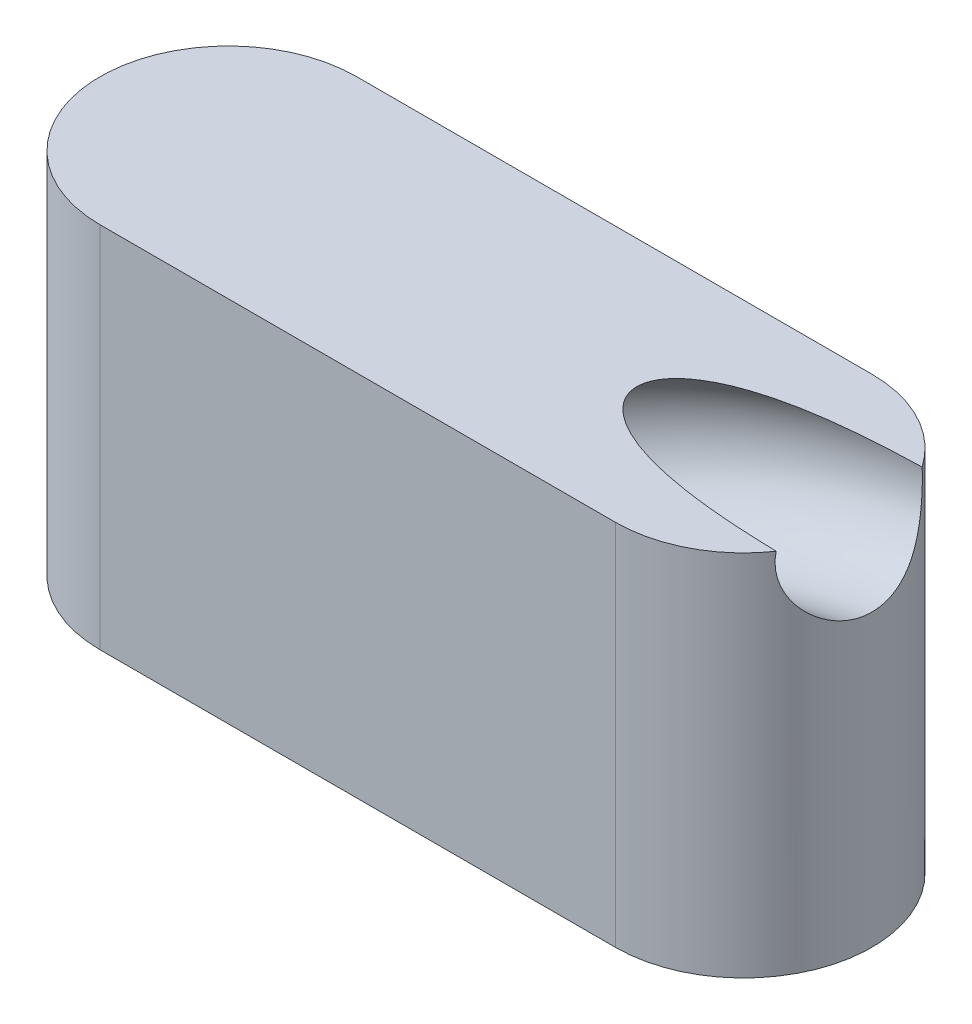
ISO-10303-21;
HEADER;
FILE_DESCRIPTION(('STEP AP214'),'2;1');
FILE_NAME('part.step','',(''),(''),'','','');
FILE_SCHEMA(('AUTOMOTIVE_DESIGN { 1 0 10303 214 1 1 1 1 }'));
ENDSEC;
DATA;
#1=APPLICATION_CONTEXT('core data for automotive mechanical design processes');
#2=APPLICATION_PROTOCOL_DEFINITION('international standard','automotive_design',2000,#1);
#3=PRODUCT_CONTEXT('',#1,'mechanical');
#4=PRODUCT('Part','Part','',(#3));
#5=PRODUCT_RELATED_PRODUCT_CATEGORY('part','',(#4));
#6=PRODUCT_DEFINITION_FORMATION('','',#4);
#7=PRODUCT_DEFINITION_CONTEXT('part definition',#1,'design');
#8=PRODUCT_DEFINITION('design','',#6,#7);
#9=PRODUCT_DEFINITION_SHAPE('','',#8);
#10=(LENGTH_UNIT() NAMED_UNIT(*) SI_UNIT(.MILLI.,.METRE.));
#11=(NAMED_UNIT(*) PLANE_ANGLE_UNIT() SI_UNIT($,.RADIAN.));
#12=(NAMED_UNIT(*) SI_UNIT($,.STERADIAN.) SOLID_ANGLE_UNIT());
#13=UNCERTAINTY_MEASURE_WITH_UNIT(LENGTH_MEASURE(1.E-05),#10,'distance_accuracy_value','');
#14=(GEOMETRIC_REPRESENTATION_CONTEXT(3) GLOBAL_UNCERTAINTY_ASSIGNED_CONTEXT((#13)) GLOBAL_UNIT_ASSIGNED_CONTEXT((#10,
#11,#12)) REPRESENTATION_CONTEXT('',''));
#15=CARTESIAN_POINT('',(0.,0.,0.));
#16=DIRECTION('',(0.,0.,1.));
#17=DIRECTION('',(1.,0.,0.));
#18=AXIS2_PLACEMENT_3D('',#15,#16,#17);
#19=CARTESIAN_POINT('',(0.362795252074542,1.,0.));
#20=DIRECTION('',(0.,-1.,0.));
#21=DIRECTION('',(0.,0.,-1.));
#22=AXIS2_PLACEMENT_3D('',#19,#20,#21);
#23=CYLINDRICAL_SURFACE('',#22,0.3484375);
#24=CARTESIAN_POINT('',(0.649361666895862,1.,0.198212969562301));
#25=CARTESIAN_POINT('',(0.648517202907294,0.991117271706397,0.199414829552838));
#26=CARTESIAN_POINT('',(0.648100500718645,0.982103586953111,0.200018826827524));
#27=CARTESIAN_POINT('',(0.648134543909756,0.964109738444706,0.199980624730701));
#28=CARTESIAN_POINT('',(0.648582619282322,0.955129557008913,0.199342261106749));
#29=CARTESIAN_POINT('',(0.650355077640837,0.937417295031375,0.19677357914616));
#30=CARTESIAN_POINT('',(0.651681716418819,0.928685913658528,0.194839934910494));
#31=CARTESIAN_POINT('',(0.655061235490028,0.911752092386084,0.189733332606763));
#32=CARTESIAN_POINT('',(0.65711412082776,0.903549656161005,0.186560365930359));
#33=CARTESIAN_POINT('',(0.664021974054252,0.880029698181463,0.17534938984082));
#34=CARTESIAN_POINT('',(0.669635671328491,0.865731251334484,0.165608522573498));
#35=CARTESIAN_POINT('',(0.681874478603899,0.838572292691496,0.14076102961292));
#36=CARTESIAN_POINT('',(0.688522043138537,0.826273695516651,0.125058537357036));
#37=CARTESIAN_POINT('',(0.697312531447876,0.81099066143996,0.098042965927252));
#38=CARTESIAN_POINT('',(0.700145355431347,0.80629487303342,0.0878743670289919));
#39=CARTESIAN_POINT('',(0.704948702998827,0.798513951304371,0.0667532125240499));
#40=CARTESIAN_POINT('',(0.706920593660662,0.79542626296138,0.0558019321598346));
#41=CARTESIAN_POINT('',(0.709782813845783,0.790984327671032,0.0336283081274207));
#42=CARTESIAN_POINT('',(0.710692378573893,0.789599227425488,0.0224146610812358));
#43=CARTESIAN_POINT('',(0.711416354160109,0.788497625898102,-0.000118422939476118));
#44=CARTESIAN_POINT('',(0.711231133382914,0.788780563368146,-0.0114378230512873));
#45=CARTESIAN_POINT('',(0.709092508884281,0.792040497473301,-0.0440469818199158));
#46=CARTESIAN_POINT('',(0.705687507834727,0.797228593328143,-0.0650662873275951));
#47=CARTESIAN_POINT('',(0.695846556975421,0.813385794278239,-0.104448879632646));
#48=CARTESIAN_POINT('',(0.689347519161211,0.824475822903307,-0.122745966379454));
#49=CARTESIAN_POINT('',(0.678871308505093,0.845296724935748,-0.146933035580533));
#50=CARTESIAN_POINT('',(0.675157310917489,0.853184297409282,-0.15459529086973));
#51=CARTESIAN_POINT('',(0.667956803955203,0.870316363527483,-0.168358820838344));
#52=CARTESIAN_POINT('',(0.664469905725943,0.879558444688783,-0.174462818964527));
#53=CARTESIAN_POINT('',(0.65888710255837,0.89714043643236,-0.183742995098132));
#54=CARTESIAN_POINT('',(0.656653078136644,0.905254344783612,-0.187265742536718));
#55=CARTESIAN_POINT('',(0.65287324314083,0.922067212811305,-0.193067962791472));
#56=CARTESIAN_POINT('',(0.651326891066837,0.930765705927303,-0.195348414159315));
#57=CARTESIAN_POINT('',(0.648985343070233,0.949490449733683,-0.198770825580921));
#58=CARTESIAN_POINT('',(0.648291471491573,0.959557509340505,-0.199759978707434));
#59=CARTESIAN_POINT('',(0.647994018418514,0.979806447728347,-0.200167458286132));
#60=CARTESIAN_POINT('',(0.648397549825227,0.989988647548834,-0.199575537327985));
#61=CARTESIAN_POINT('',(0.649361666895862,1.,-0.1982129695623));
#62=B_SPLINE_CURVE_WITH_KNOTS('',3,(#24,#25,#26,#27,#28,#29,#30,#31,#32,#33,#34,#35,#36,#37,#38,
#39,#40,#41,#42,#43,#44,#45,#46,#47,#48,#49,#50,#51,#52,#53,#54,#55,#56,#57,#58,#59,#60,#61),
.UNSPECIFIED.,.F.,.F.,(4,2,2,2,2,2,2,2,2,2,2,2,2,2,2,2,2,2,4),(0.,0.0269951663870324,
0.0539071183168555,0.0808884384493803,0.107869945997655,0.161633355234993,0.223688936611937,
0.258205788611387,0.292667630104178,0.326495302563187,0.360311593604739,0.424804622556855,
0.490672998104435,0.52534944492066,0.559964864457072,0.58722021021727,0.614454055892135,
0.644683282892519,0.675108909109647),.UNSPECIFIED.);
#63=CARTESIAN_POINT('',(0.649361666908891,1.,0.198212969562642));
#64=VERTEX_POINT('',#63);
#65=CARTESIAN_POINT('',(0.649361666895862,1.,-0.198212969562301));
#66=VERTEX_POINT('',#65);
#67=EDGE_CURVE('E54',#64,#66,#62,.T.);
#68=ORIENTED_EDGE('',*,*,#67,.F.);
#69=CARTESIAN_POINT('',(0.362795252074542,1.,0.));
#70=DIRECTION('',(0.,1.,0.));
#71=DIRECTION('',(0.,0.,1.));
#72=AXIS2_PLACEMENT_3D('',#69,#70,#71);
#73=CIRCLE('',#72,0.3484375);
#74=CARTESIAN_POINT('',(0.362795252074542,1.,0.3484375));
#75=VERTEX_POINT('',#74);
#76=EDGE_CURVE('E164',#75,#64,#73,.T.);
#77=ORIENTED_EDGE('',*,*,#76,.F.);
#78=DIRECTION('',(0.,-1.,0.));
#79=VECTOR('',#78,1.);
#80=CARTESIAN_POINT('',(0.362795252074542,1.,0.3484375));
#81=LINE('',#80,#79);
#82=CARTESIAN_POINT('',(0.362795252074542,0.,0.3484375));
#83=VERTEX_POINT('',#82);
#84=EDGE_CURVE('E102',#75,#83,#81,.T.);
#85=ORIENTED_EDGE('',*,*,#84,.T.);
#86=CARTESIAN_POINT('',(0.362795252074542,0.,0.));
#87=DIRECTION('',(0.,1.,0.));
#88=DIRECTION('',(0.,0.,1.));
#89=AXIS2_PLACEMENT_3D('',#86,#87,#88);
#90=CIRCLE('',#89,0.3484375);
#91=CARTESIAN_POINT('',(0.362795252074542,0.,-0.3484375));
#92=VERTEX_POINT('',#91);
#93=EDGE_CURVE('E111',#83,#92,#90,.T.);
#94=ORIENTED_EDGE('',*,*,#93,.T.);
#95=DIRECTION('',(0.,-1.,0.));
#96=VECTOR('',#95,1.);
#97=CARTESIAN_POINT('',(0.362795252074542,1.,-0.3484375));
#98=LINE('',#97,#96);
#99=CARTESIAN_POINT('',(0.362795252074542,1.,-0.3484375));
#100=VERTEX_POINT('',#99);
#101=EDGE_CURVE('E120',#100,#92,#98,.T.);
#102=ORIENTED_EDGE('',*,*,#101,.F.);
#103=EDGE_CURVE('E167',#66,#100,#73,.T.);
#104=ORIENTED_EDGE('',*,*,#103,.F.);
#105=EDGE_LOOP('',(#68,#77,#85,#94,#102,#104));
#106=FACE_BOUND('',#105,.T.);
#107=ADVANCED_FACE('F35',(#106),#23,.T.);
#108=CARTESIAN_POINT('',(0.,1.,0.));
#109=DIRECTION('',(0.,1.,0.));
#110=DIRECTION('',(0.,0.,1.));
#111=AXIS2_PLACEMENT_3D('',#108,#109,#110);
#112=PLANE('',#111);
#113=ORIENTED_EDGE('',*,*,#76,.T.);
#114=CARTESIAN_POINT('',(0.723814002074542,1.,0.199559610287932));
#115=CARTESIAN_POINT('',(0.703405166295891,1.00000000000004,0.199332418436753));
#116=CARTESIAN_POINT('',(0.682996072813127,1.00000000000002,0.199007798475352));
#117=CARTESIAN_POINT('',(0.642132369386596,0.999999999999981,0.198067815406427));
#118=CARTESIAN_POINT('',(0.621677777141294,0.999999999999961,0.19745170783836));
#119=CARTESIAN_POINT('',(0.580762386859649,1.00000000000004,0.195832238535436));
#120=CARTESIAN_POINT('',(0.560301603298726,1.00000000000014,0.194828487651405));
#121=CARTESIAN_POINT('',(0.518542405981056,0.999999999999859,0.192261338113752));
#122=CARTESIAN_POINT('',(0.497245310424176,0.999999999999465,0.190675988421826));
#123=CARTESIAN_POINT('',(0.4547293033293,1.00000000000053,0.186793778318933));
#124=CARTESIAN_POINT('',(0.433510343090811,1.000000000002,0.184497484633373));
#125=CARTESIAN_POINT('',(0.391207281935416,0.999999999998004,0.178980139996886));
#126=CARTESIAN_POINT('',(0.370123115214191,0.999999999992554,0.175759582200526));
#127=CARTESIAN_POINT('',(0.317927704168776,0.999999999988212,0.166269134700934));
#128=CARTESIAN_POINT('',(0.286929568180333,0.999999999993805,0.159278002224989));
#129=CARTESIAN_POINT('',(0.241472651058109,1.00000000000307,0.145732331470315));
#130=CARTESIAN_POINT('',(0.226554380371177,1.00000000000629,0.140734653105423));
#131=CARTESIAN_POINT('',(0.197201087307615,0.999999999993701,0.129394161689924));
#132=CARTESIAN_POINT('',(0.182766569015562,0.999999999977871,0.123049993108442));
#133=CARTESIAN_POINT('',(0.157945727841669,0.999999999982307,0.110176031778146));
#134=CARTESIAN_POINT('',(0.147376873597486,0.999999999995281,0.104006141366335));
#135=CARTESIAN_POINT('',(0.127217196176411,1.0000000000047,0.0902670126338788));
#136=CARTESIAN_POINT('',(0.117622997273348,1.00000000000121,0.0827028787819455));
#137=CARTESIAN_POINT('',(0.0999709409087105,0.999999999998659,0.0655791482820708));
#138=CARTESIAN_POINT('',(0.0919406747504289,0.999999999999678,0.0559890354423328));
#139=CARTESIAN_POINT('',(0.0804030457784911,1.00000000000027,0.0362888786313305));
#140=CARTESIAN_POINT('',(0.0763735785141326,1.00000000000005,0.0265150116655929));
#141=CARTESIAN_POINT('',(0.0732161845373014,0.999999999999975,0.0112064831594961));
#142=CARTESIAN_POINT('',(0.0726500459924456,0.999999999999993,0.00596392490293829));
#143=CARTESIAN_POINT('',(0.0725564279538344,1.00000000000001,-0.00452984965842318));
#144=CARTESIAN_POINT('',(0.0730287466444804,1.,-0.0097810640827856));
#145=CARTESIAN_POINT('',(0.0756772729787471,0.999999999999995,-0.0238530994933758));
#146=CARTESIAN_POINT('',(0.0788434564659947,0.999999999999999,-0.0324900716693002));
#147=CARTESIAN_POINT('',(0.0895387594081238,1.,-0.0530189917884646));
#148=CARTESIAN_POINT('',(0.0985072593337248,1.,-0.0641057372623232));
#149=CARTESIAN_POINT('',(0.117400947807949,0.999999999999999,-0.0825328240954383));
#150=CARTESIAN_POINT('',(0.127071837992941,1.,-0.0901665438062459));
#151=CARTESIAN_POINT('',(0.147401326711332,1.,-0.104024184576535));
#152=CARTESIAN_POINT('',(0.158062416424782,1.,-0.110244406313198));
#153=CARTESIAN_POINT('',(0.183843944138124,0.999999999999997,-0.123597912190108));
#154=CARTESIAN_POINT('',(0.199198721126587,0.99999999999999,-0.13026562678008));
#155=CARTESIAN_POINT('',(0.230438527768441,1.00000000000001,-0.14211606641372));
#156=CARTESIAN_POINT('',(0.246323241270974,1.00000000000004,-0.147299659775819));
#157=CARTESIAN_POINT('',(0.29475189911505,0.999999999999925,-0.161274988381435));
#158=CARTESIAN_POINT('',(0.327782051809523,0.999999999999586,-0.168362979645339));
#159=CARTESIAN_POINT('',(0.381368615412435,0.999999999999717,-0.1775181533015));
#160=CARTESIAN_POINT('',(0.401798534202616,0.999999999999924,-0.180466579146242));
#161=CARTESIAN_POINT('',(0.442774291333739,1.00000000000008,-0.185531332958379));
#162=CARTESIAN_POINT('',(0.463320177951224,1.00000000000002,-0.187647283745508));
#163=CARTESIAN_POINT('',(0.504478663703542,0.99999999999998,-0.191234617091081));
#164=CARTESIAN_POINT('',(0.525091298601411,0.999999999999995,-0.192705562049981));
#165=CARTESIAN_POINT('',(0.565509943908318,1.00000000000001,-0.19509518161076));
#166=CARTESIAN_POINT('',(0.585314796627791,1.,-0.196033818524319));
#167=CARTESIAN_POINT('',(0.624920521614708,0.999999999999999,-0.197553946380209));
#168=CARTESIAN_POINT('',(0.644721382934847,0.999999999999999,-0.19813574047801));
#169=CARTESIAN_POINT('',(0.684286217177371,1.,-0.199028401122379));
#170=CARTESIAN_POINT('',(0.704050176414334,1.,-0.19933985552889));
#171=CARTESIAN_POINT('',(0.723814002074542,0.999999999999999,-0.199559610287932));
#172=B_SPLINE_CURVE_WITH_KNOTS('',3,(#114,#115,#116,#117,#118,#119,#120,#121,#122,#123,#124,
#125,#126,#127,#128,#129,#130,#131,#132,#133,#134,#135,#136,#137,#138,#139,#140,#141,#142,#143,
#144,#145,#146,#147,#148,#149,#150,#151,#152,#153,#154,#155,#156,#157,#158,#159,#160,#161,#162,
#163,#164,#165,#166,#167,#168,#169,#170,#171),.UNSPECIFIED.,.F.,.F.,(4,2,2,2,2,2,2,2,2,2,2,2,2,
2,2,2,2,2,2,2,2,2,2,2,2,2,2,2,4),(0.,0.0612320972237044,0.122621432730623,0.184072556921487,
0.248132637806722,0.312141784431897,0.3761168413407,0.471222066906372,0.518379242892503,
0.565584119790097,0.602215142914862,0.638714627894934,0.6758090516198,0.706891466622746,
0.722612886202471,0.738331250724045,0.765490512584862,0.807512090683877,0.844352520428344,
0.881288283932266,0.93139724920439,0.981476836910738,1.08257311794669,1.14449163862772,
1.2064381813163,1.26842668640897,1.32790350061017,1.38732971609985,1.44662638181955),.UNSPECIFIED.);
#173=EDGE_CURVE('E11',#64,#66,#172,.T.);
#174=ORIENTED_EDGE('',*,*,#173,.T.);
#175=ORIENTED_EDGE('',*,*,#103,.T.);
#176=DIRECTION('',(1.,0.,0.));
#177=VECTOR('',#176,1.);
#178=CARTESIAN_POINT('',(0.,1.,-0.3484375));
#179=LINE('',#178,#177);
#180=CARTESIAN_POINT('',(-1.03720474792546,1.,-0.3484375));
#181=VERTEX_POINT('',#180);
#182=EDGE_CURVE('E170',#181,#100,#179,.T.);
#183=ORIENTED_EDGE('',*,*,#182,.F.);
#184=CARTESIAN_POINT('',(-1.03720474792546,1.,0.));
#185=DIRECTION('',(0.,1.,0.));
#186=DIRECTION('',(0.,0.,1.));
#187=AXIS2_PLACEMENT_3D('',#184,#185,#186);
#188=CIRCLE('',#187,0.3484375);
#189=CARTESIAN_POINT('',(-1.03720474792546,1.,0.3484375));
#190=VERTEX_POINT('',#189);
#191=EDGE_CURVE('E118',#181,#190,#188,.T.);
#192=ORIENTED_EDGE('',*,*,#191,.T.);
#193=DIRECTION('',(1.,0.,0.));
#194=VECTOR('',#193,1.);
#195=CARTESIAN_POINT('',(0.,1.,0.3484375));
#196=LINE('',#195,#194);
#197=EDGE_CURVE('E109',#190,#75,#196,.T.);
#198=ORIENTED_EDGE('',*,*,#197,.T.);
#199=EDGE_LOOP('',(#113,#174,#175,#183,#192,#198));
#200=FACE_BOUND('',#199,.T.);
#201=ADVANCED_FACE('F156',(#200),#112,.T.);
#202=CARTESIAN_POINT('',(0.,1.,0.3484375));
#203=DIRECTION('',(0.,0.,-1.));
#204=DIRECTION('',(-1.,0.,0.));
#205=AXIS2_PLACEMENT_3D('',#202,#203,#204);
#206=PLANE('',#205);
#207=DIRECTION('',(1.,0.,0.));
#208=VECTOR('',#207,1.);
#209=CARTESIAN_POINT('',(0.,0.,0.3484375));
#210=LINE('',#209,#208);
#211=CARTESIAN_POINT('',(-1.03720474792546,0.,0.3484375));
#212=VERTEX_POINT('',#211);
#213=EDGE_CURVE('E106',#212,#83,#210,.T.);
#214=ORIENTED_EDGE('',*,*,#213,.T.);
#215=ORIENTED_EDGE('',*,*,#84,.F.);
#216=ORIENTED_EDGE('',*,*,#197,.F.);
#217=DIRECTION('',(0.,-1.,0.));
#218=VECTOR('',#217,1.);
#219=CARTESIAN_POINT('',(-1.03720474792546,1.,0.3484375));
#220=LINE('',#219,#218);
#221=EDGE_CURVE('E115',#190,#212,#220,.T.);
#222=ORIENTED_EDGE('',*,*,#221,.T.);
#223=EDGE_LOOP('',(#214,#215,#216,#222));
#224=FACE_BOUND('',#223,.T.);
#225=ADVANCED_FACE('F37',(#224),#206,.F.);
#226=CARTESIAN_POINT('',(0.,1.,-0.3484375));
#227=DIRECTION('',(0.,0.,-1.));
#228=DIRECTION('',(-1.,0.,0.));
#229=AXIS2_PLACEMENT_3D('',#226,#227,#228);
#230=PLANE('',#229);
#231=DIRECTION('',(1.,0.,0.));
#232=VECTOR('',#231,1.);
#233=CARTESIAN_POINT('',(0.,0.,-0.3484375));
#234=LINE('',#233,#232);
#235=CARTESIAN_POINT('',(-1.03720474792546,0.,-0.3484375));
#236=VERTEX_POINT('',#235);
#237=EDGE_CURVE('E107',#236,#92,#234,.T.);
#238=ORIENTED_EDGE('',*,*,#237,.F.);
#239=DIRECTION('',(0.,-1.,0.));
#240=VECTOR('',#239,1.);
#241=CARTESIAN_POINT('',(-1.03720474792546,1.,-0.3484375));
#242=LINE('',#241,#240);
#243=EDGE_CURVE('E117',#181,#236,#242,.T.);
#244=ORIENTED_EDGE('',*,*,#243,.F.);
#245=ORIENTED_EDGE('',*,*,#182,.T.);
#246=ORIENTED_EDGE('',*,*,#101,.T.);
#247=EDGE_LOOP('',(#238,#244,#245,#246));
#248=FACE_BOUND('',#247,.T.);
#249=ADVANCED_FACE('F151',(#248),#230,.T.);
#250=CARTESIAN_POINT('',(-1.03720474792546,1.,0.));
#251=DIRECTION('',(0.,-1.,0.));
#252=DIRECTION('',(0.,0.,-1.));
#253=AXIS2_PLACEMENT_3D('',#250,#251,#252);
#254=CYLINDRICAL_SURFACE('',#253,0.3484375);
#255=CARTESIAN_POINT('',(-1.03720474792546,0.,0.));
#256=DIRECTION('',(0.,1.,0.));
#257=DIRECTION('',(0.,0.,1.));
#258=AXIS2_PLACEMENT_3D('',#255,#256,#257);
#259=CIRCLE('',#258,0.3484375);
#260=CARTESIAN_POINT('',(-1.32302411635154,0.,-0.199288685174958));
#261=VERTEX_POINT('',#260);
#262=EDGE_CURVE('E97',#236,#261,#259,.T.);
#263=ORIENTED_EDGE('',*,*,#262,.T.);
#264=CARTESIAN_POINT('',(-1.32302411635154,0.,-0.199288685174957));
#265=CARTESIAN_POINT('',(-1.32248098585934,0.00905124269627235,-0.200048122509492));
#266=CARTESIAN_POINT('',(-1.32237717872784,0.0181897564897757,-0.200208764880249));
#267=CARTESIAN_POINT('',(-1.32303631595712,0.0363445553302654,-0.199277389109151));
#268=CARTESIAN_POINT('',(-1.32379690318763,0.0453611052570405,-0.198188777498394));
#269=CARTESIAN_POINT('',(-1.32617345528739,0.0630523466319441,-0.1947036441222));
#270=CARTESIAN_POINT('',(-1.32779182940324,0.0717260008915069,-0.192303437919541));
#271=CARTESIAN_POINT('',(-1.33170920291049,0.0884476832746563,-0.186249939458238));
#272=CARTESIAN_POINT('',(-1.3340081111446,0.0964957950072577,-0.182596815017146));
#273=CARTESIAN_POINT('',(-1.34152786775986,0.119337150006703,-0.16997014763793));
#274=CARTESIAN_POINT('',(-1.34740188184637,0.132997180799245,-0.159293919761165));
#275=CARTESIAN_POINT('',(-1.35975369687347,0.158342286551954,-0.132717506038557));
#276=CARTESIAN_POINT('',(-1.36620019371086,0.169479219580518,-0.116293720288771));
#277=CARTESIAN_POINT('',(-1.37730543970788,0.187674821649596,-0.0785094301333011));
#278=CARTESIAN_POINT('',(-1.38171733444075,0.194206890389753,-0.0568175784218504));
#279=CARTESIAN_POINT('',(-1.38615034386878,0.200767875874122,-0.0121065539396438));
#280=CARTESIAN_POINT('',(-1.38618778031744,0.200820966680103,0.0109073642385806));
#281=CARTESIAN_POINT('',(-1.38196601970391,0.194576982366869,0.0550751065098025));
#282=CARTESIAN_POINT('',(-1.37780086964362,0.188418904133014,0.0762586227437397));
#283=CARTESIAN_POINT('',(-1.36655932205963,0.170128554656573,0.115576962264659));
#284=CARTESIAN_POINT('',(-1.35942616715821,0.157878848540628,0.133642056388982));
#285=CARTESIAN_POINT('',(-1.34858208563983,0.135294677092673,0.156617284469976));
#286=CARTESIAN_POINT('',(-1.34491721861542,0.126991903225214,0.163622739981041));
#287=CARTESIAN_POINT('',(-1.3380324149416,0.109054899240248,0.175955924377772));
#288=CARTESIAN_POINT('',(-1.33481164225252,0.0994232412043139,0.181286830603282));
#289=CARTESIAN_POINT('',(-1.32961329006294,0.0801886250080146,0.189545675835665));
#290=CARTESIAN_POINT('',(-1.32753835149338,0.0706974211993188,0.192672470213391));
#291=CARTESIAN_POINT('',(-1.32441255610087,0.0511614093255887,0.197302763819104));
#292=CARTESIAN_POINT('',(-1.32336124931816,0.0411168465550275,0.198806976319902));
#293=CARTESIAN_POINT('',(-1.32261114022754,0.0258395851271172,0.199879757909744));
#294=CARTESIAN_POINT('',(-1.32250227774133,0.020656911472093,0.200035275277853));
#295=CARTESIAN_POINT('',(-1.32256054445219,0.0103088704339392,0.199951658567757));
#296=CARTESIAN_POINT('',(-1.32272698610144,0.00514349212233509,0.199713507642351));
#297=CARTESIAN_POINT('',(-1.32302411635154,0.,0.199288685174958));
#298=B_SPLINE_CURVE_WITH_KNOTS('',3,(#264,#265,#266,#267,#268,#269,#270,#271,#272,#273,#274,
#275,#276,#277,#278,#279,#280,#281,#282,#283,#284,#285,#286,#287,#288,#289,#290,#291,#292,#293,
#294,#295,#296,#297),.UNSPECIFIED.,.F.,.F.,(4,2,2,2,2,2,2,2,2,2,2,2,2,2,2,2,4),(0.,
0.0272851338937106,0.0544960416952917,0.0817837843336239,0.109067873441483,0.163132721460462,
0.224803053201291,0.292712686504393,0.36036893075905,0.426543996582564,0.494047349932425,
0.528280675478983,0.562448647749929,0.592884912266571,0.623307791808055,0.638846840913065,
0.65434714117588),.UNSPECIFIED.);
#299=CARTESIAN_POINT('',(-1.3230241163674,0.,0.199288685175334));
#300=VERTEX_POINT('',#299);
#301=EDGE_CURVE('E60',#261,#300,#298,.T.);
#302=ORIENTED_EDGE('',*,*,#301,.T.);
#303=EDGE_CURVE('E94',#300,#212,#259,.T.);
#304=ORIENTED_EDGE('',*,*,#303,.T.);
#305=ORIENTED_EDGE('',*,*,#221,.F.);
#306=ORIENTED_EDGE('',*,*,#191,.F.);
#307=ORIENTED_EDGE('',*,*,#243,.T.);
#308=EDGE_LOOP('',(#263,#302,#304,#305,#306,#307));
#309=FACE_BOUND('',#308,.T.);
#310=ADVANCED_FACE('F91',(#309),#254,.T.);
#311=CARTESIAN_POINT('',(0.,0.,0.));
#312=DIRECTION('',(0.,1.,0.));
#313=DIRECTION('',(0.,0.,1.));
#314=AXIS2_PLACEMENT_3D('',#311,#312,#313);
#315=PLANE('',#314);
#316=ORIENTED_EDGE('',*,*,#303,.F.);
#317=CARTESIAN_POINT('',(-1.38564224792546,0.,0.2));
#318=CARTESIAN_POINT('',(-1.35481887145929,0.,0.199976059087652));
#319=CARTESIAN_POINT('',(-1.32396872728608,0.,0.199525110544196));
#320=CARTESIAN_POINT('',(-1.26206996591264,0.,0.197222520761048));
#321=CARTESIAN_POINT('',(-1.23102181043587,0.,0.195359357245526));
#322=CARTESIAN_POINT('',(-1.16797827909533,0.,0.189565573175973));
#323=CARTESIAN_POINT('',(-1.13598909202974,0.,0.185562863381705));
#324=CARTESIAN_POINT('',(-1.0725918881736,0.,0.174535761501368));
#325=CARTESIAN_POINT('',(-1.04118216596449,0.,0.167522542726877));
#326=CARTESIAN_POINT('',(-0.994659478337774,0.,0.153417159210536));
#327=CARTESIAN_POINT('',(-0.979040188492619,0.,0.148017456611353));
#328=CARTESIAN_POINT('',(-0.948462785339075,0.,0.135646862318148));
#329=CARTESIAN_POINT('',(-0.933502879797941,0.,0.128680589843769));
#330=CARTESIAN_POINT('',(-0.908988663799288,0.,0.115023583060182));
#331=CARTESIAN_POINT('',(-0.899145563265995,0.,0.108862247270857));
#332=CARTESIAN_POINT('',(-0.880400835941521,0.,0.0952603420971086));
#333=CARTESIAN_POINT('',(-0.87149750070769,0.,0.0878221609635562));
#334=CARTESIAN_POINT('',(-0.853532177835599,0.,0.0696509086399842));
#335=CARTESIAN_POINT('',(-0.844806647365007,0.,0.058555356377662));
#336=CARTESIAN_POINT('',(-0.8330013054004,0.,0.0362670895501428));
#337=CARTESIAN_POINT('',(-0.829150265930359,0.,0.0255193999433833));
#338=CARTESIAN_POINT('',(-0.826455614306845,0.,0.00886708077552475));
#339=CARTESIAN_POINT('',(-0.826076554472385,0.,0.00320039729948));
#340=CARTESIAN_POINT('',(-0.826385221647447,0.,-0.00810397318121864));
#341=CARTESIAN_POINT('',(-0.827073029884628,0.,-0.013741657945221));
#342=CARTESIAN_POINT('',(-0.83041830314973,0.,-0.0292452205749378));
#343=CARTESIAN_POINT('',(-0.834214298168893,0.,-0.038868871088919));
#344=CARTESIAN_POINT('',(-0.846836236918601,0.,-0.0618054265471953));
#345=CARTESIAN_POINT('',(-0.857289030402028,0.,-0.0741617422348252));
#346=CARTESIAN_POINT('',(-0.879023336239704,0.,-0.0943863983653453));
#347=CARTESIAN_POINT('',(-0.889985434791156,0.,-0.102640463540992));
#348=CARTESIAN_POINT('',(-0.912984378895609,0.,-0.11752963677161));
#349=CARTESIAN_POINT('',(-0.925023629599419,0.,-0.124160991758108));
#350=CARTESIAN_POINT('',(-0.950333141271247,0.,-0.136434073720487));
#351=CARTESIAN_POINT('',(-0.963634867226729,0.,-0.142008651771557));
#352=CARTESIAN_POINT('',(-0.990658323343937,0.,-0.152041754595772));
#353=CARTESIAN_POINT('',(-1.00438043454658,0.,-0.156499231083504));
#354=CARTESIAN_POINT('',(-1.04606405458787,0.,-0.168565147845365));
#355=CARTESIAN_POINT('',(-1.07441664679182,0.,-0.174812124236636));
#356=CARTESIAN_POINT('',(-1.12655574294383,0.,-0.183953905335825));
#357=CARTESIAN_POINT('',(-1.15028080248736,0.,-0.187242305085135));
#358=CARTESIAN_POINT('',(-1.19788865344264,0.,-0.192525932786483));
#359=CARTESIAN_POINT('',(-1.22177153335443,0.,-0.194520359464868));
#360=CARTESIAN_POINT('',(-1.26899793958235,0.,-0.19748264044786));
#361=CARTESIAN_POINT('',(-1.2923400872122,0.,-0.198474821218643));
#362=CARTESIAN_POINT('',(-1.33900423513261,0.,-0.199729635013556));
#363=CARTESIAN_POINT('',(-1.3623261992777,0.,-0.199993540739513));
#364=CARTESIAN_POINT('',(-1.38564224792546,0.,-0.2));
#365=B_SPLINE_CURVE_WITH_KNOTS('',3,(#317,#318,#319,#320,#321,#322,#323,#324,#325,#326,#327,
#328,#329,#330,#331,#332,#333,#334,#335,#336,#337,#338,#339,#340,#341,#342,#343,#344,#345,#346,
#347,#348,#349,#350,#351,#352,#353,#354,#355,#356,#357,#358,#359,#360,#361,#362,#363,#364),
.UNSPECIFIED.,.F.,.F.,(4,2,2,2,2,2,2,2,2,2,2,2,2,2,2,2,2,2,2,2,2,2,2,4),(0.,0.0925100008527268,
0.185783026866866,0.282417521904032,0.378696423712017,0.428217297319976,0.477594023960392,
0.512347532220875,0.547036730968565,0.588785539930565,0.622354076289905,0.639295722999572,
0.656238659651162,0.68679462225384,0.734481711578497,0.775511442244878,0.816635189724929,
0.85984215299869,0.903089511030489,0.989993531505997,1.06181667375551,1.1336842490796,
1.20376221493133,1.27371763778732),.UNSPECIFIED.);
#366=EDGE_CURVE('E48',#300,#261,#365,.T.);
#367=ORIENTED_EDGE('',*,*,#366,.T.);
#368=ORIENTED_EDGE('',*,*,#262,.F.);
#369=ORIENTED_EDGE('',*,*,#237,.T.);
#370=ORIENTED_EDGE('',*,*,#93,.F.);
#371=ORIENTED_EDGE('',*,*,#213,.F.);
#372=EDGE_LOOP('',(#316,#367,#368,#369,#370,#371));
#373=FACE_BOUND('',#372,.T.);
#374=ADVANCED_FACE('F104',(#373),#315,.F.);
#375=CARTESIAN_POINT('',(-0.445928667687543,0.46828524305832,0.));
#376=DIRECTION('',(-0.912626265399506,-0.408794936004534,0.));
#377=DIRECTION('',(0.,0.,1.));
#378=AXIS2_PLACEMENT_3D('',#375,#376,#377);
#379=CIRCLE('',#378,0.2);
#380=CARTESIAN_POINT('',(1.13181766817374,-1.51145750285431,0.));
#381=DIRECTION('',(0.,0.,-1.));
#382=AXIS1_PLACEMENT('',#380,#381);
#383=SURFACE_OF_REVOLUTION('',#379,#382);
#384=CARTESIAN_POINT('',(-0.445928667687543,0.46828524305832,0.2));
#385=VERTEX_POINT('',#384);
#386=EDGE_CURVE('E98',#385,#385,#379,.T.);
#387=ORIENTED_EDGE('',*,*,#386,.T.);
#388=EDGE_LOOP('',(#387));
#389=FACE_BOUND('',#388,.T.);
#390=ORIENTED_EDGE('',*,*,#67,.T.);
#391=ORIENTED_EDGE('',*,*,#173,.F.);
#392=EDGE_LOOP('',(#390,#391));
#393=FACE_BOUND('',#392,.T.);
#394=ADVANCED_FACE('F133',(#389,#393),#383,.F.);
#395=CARTESIAN_POINT('',(-2.01126705100608,2.43245859515916,0.));
#396=DIRECTION('',(0.,0.,-1.));
#397=AXIS1_PLACEMENT('',#395,#396);
#398=SURFACE_OF_REVOLUTION('',#379,#397);
#399=ORIENTED_EDGE('',*,*,#386,.F.);
#400=EDGE_LOOP('',(#399));
#401=FACE_BOUND('',#400,.T.);
#402=ORIENTED_EDGE('',*,*,#366,.F.);
#403=ORIENTED_EDGE('',*,*,#301,.F.);
#404=EDGE_LOOP('',(#402,#403));
#405=FACE_BOUND('',#404,.T.);
#406=ADVANCED_FACE('F100',(#401,#405),#398,.T.);
#407=CLOSED_SHELL('',(#107,#201,#225,#249,#310,#374,#394,#406));
#408=MANIFOLD_SOLID_BREP('B2',#407);
#409=ADVANCED_BREP_SHAPE_REPRESENTATION('',(#18,#408),#14);
#410=SHAPE_DEFINITION_REPRESENTATION(#9,#409);
ENDSEC;
END-ISO-10303-21;
